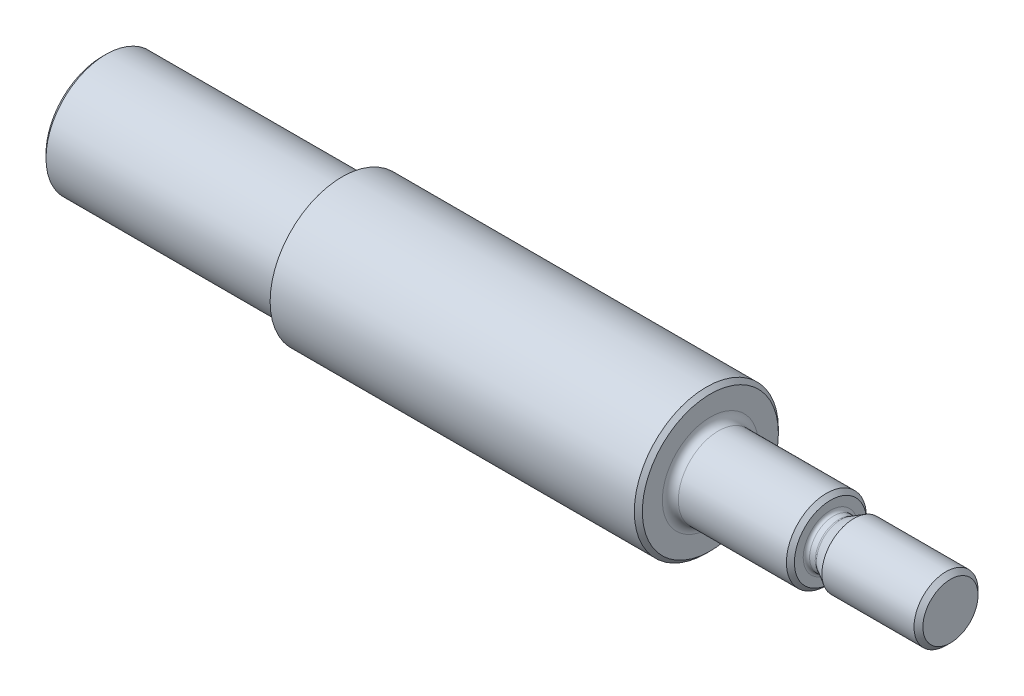
ISO-10303-21;
HEADER;
FILE_DESCRIPTION(('STEP AP214'),'2;1');
FILE_NAME('part.step','',(''),(''),'','','');
FILE_SCHEMA(('AUTOMOTIVE_DESIGN { 1 0 10303 214 1 1 1 1 }'));
ENDSEC;
DATA;
#1=APPLICATION_CONTEXT('core data for automotive mechanical design processes');
#2=APPLICATION_PROTOCOL_DEFINITION('international standard','automotive_design',2000,#1);
#3=PRODUCT_CONTEXT('',#1,'mechanical');
#4=PRODUCT('Part','Part','',(#3));
#5=PRODUCT_RELATED_PRODUCT_CATEGORY('part','',(#4));
#6=PRODUCT_DEFINITION_FORMATION('','',#4);
#7=PRODUCT_DEFINITION_CONTEXT('part definition',#1,'design');
#8=PRODUCT_DEFINITION('design','',#6,#7);
#9=PRODUCT_DEFINITION_SHAPE('','',#8);
#10=(LENGTH_UNIT() NAMED_UNIT(*) SI_UNIT(.MILLI.,.METRE.));
#11=(NAMED_UNIT(*) PLANE_ANGLE_UNIT() SI_UNIT($,.RADIAN.));
#12=(NAMED_UNIT(*) SI_UNIT($,.STERADIAN.) SOLID_ANGLE_UNIT());
#13=UNCERTAINTY_MEASURE_WITH_UNIT(LENGTH_MEASURE(1.E-05),#10,'distance_accuracy_value','');
#14=(GEOMETRIC_REPRESENTATION_CONTEXT(3) GLOBAL_UNCERTAINTY_ASSIGNED_CONTEXT((#13)) GLOBAL_UNIT_ASSIGNED_CONTEXT((#10,
#11,#12)) REPRESENTATION_CONTEXT('',''));
#15=CARTESIAN_POINT('',(0.,0.,0.));
#16=DIRECTION('',(0.,0.,1.));
#17=DIRECTION('',(1.,0.,0.));
#18=AXIS2_PLACEMENT_3D('',#15,#16,#17);
#19=CARTESIAN_POINT('',(0.,0.,0.));
#20=DIRECTION('',(-1.,0.,0.));
#21=DIRECTION('',(0.,0.,1.));
#22=AXIS2_PLACEMENT_3D('',#19,#20,#21);
#23=PLANE('',#22);
#24=CARTESIAN_POINT('',(0.,0.,0.));
#25=DIRECTION('',(-1.,0.,0.));
#26=DIRECTION('',(0.,0.,1.));
#27=AXIS2_PLACEMENT_3D('',#24,#25,#26);
#28=CIRCLE('',#27,6.99999999999998);
#29=CARTESIAN_POINT('',(0.,0.,-6.99999999999998));
#30=VERTEX_POINT('',#29);
#31=EDGE_CURVE('E92',#30,#30,#28,.T.);
#32=ORIENTED_EDGE('',*,*,#31,.T.);
#33=EDGE_LOOP('',(#32));
#34=FACE_BOUND('',#33,.T.);
#35=ADVANCED_FACE('F59',(#34),#23,.T.);
#36=CARTESIAN_POINT('',(0.,0.,0.));
#37=DIRECTION('',(-1.,0.,0.));
#38=DIRECTION('',(0.,0.,1.));
#39=AXIS2_PLACEMENT_3D('',#36,#37,#38);
#40=CYLINDRICAL_SURFACE('',#39,7.5);
#41=CARTESIAN_POINT('',(0.500000000000014,0.,0.));
#42=DIRECTION('',(-1.,0.,0.));
#43=DIRECTION('',(0.,0.,1.));
#44=AXIS2_PLACEMENT_3D('',#41,#42,#43);
#45=CIRCLE('',#44,7.5);
#46=CARTESIAN_POINT('',(0.500000000000014,0.,-7.49999999999999));
#47=VERTEX_POINT('',#46);
#48=EDGE_CURVE('E89',#47,#47,#45,.F.);
#49=ORIENTED_EDGE('',*,*,#48,.T.);
#50=EDGE_LOOP('',(#49));
#51=FACE_BOUND('',#50,.T.);
#52=CARTESIAN_POINT('',(29.,0.,0.));
#53=DIRECTION('',(-1.,0.,0.));
#54=DIRECTION('',(0.,0.,1.));
#55=AXIS2_PLACEMENT_3D('',#52,#53,#54);
#56=CIRCLE('',#55,7.5);
#57=CARTESIAN_POINT('',(29.,0.,7.5));
#58=VERTEX_POINT('',#57);
#59=EDGE_CURVE('E100',#58,#58,#56,.T.);
#60=ORIENTED_EDGE('',*,*,#59,.T.);
#61=EDGE_LOOP('',(#60));
#62=FACE_BOUND('',#61,.T.);
#63=ADVANCED_FACE('F164',(#51,#62),#40,.T.);
#64=CARTESIAN_POINT('',(30.,-7.49999999999999,0.));
#65=DIRECTION('',(-1.,0.,0.));
#66=DIRECTION('',(0.,0.,1.));
#67=AXIS2_PLACEMENT_3D('',#64,#65,#66);
#68=PLANE('',#67);
#69=CARTESIAN_POINT('',(30.,0.,0.));
#70=DIRECTION('',(-1.,0.,0.));
#71=DIRECTION('',(0.,0.,1.));
#72=AXIS2_PLACEMENT_3D('',#69,#70,#71);
#73=CIRCLE('',#72,8.5);
#74=CARTESIAN_POINT('',(30.,0.,8.5));
#75=VERTEX_POINT('',#74);
#76=EDGE_CURVE('E96',#75,#75,#73,.F.);
#77=ORIENTED_EDGE('',*,*,#76,.T.);
#78=EDGE_LOOP('',(#77));
#79=FACE_BOUND('',#78,.T.);
#80=CARTESIAN_POINT('',(30.,0.,0.));
#81=DIRECTION('',(-1.,0.,0.));
#82=DIRECTION('',(0.,0.,1.));
#83=AXIS2_PLACEMENT_3D('',#80,#81,#82);
#84=CIRCLE('',#83,9.);
#85=CARTESIAN_POINT('',(30.,0.,9.));
#86=VERTEX_POINT('',#85);
#87=EDGE_CURVE('E112',#86,#86,#84,.T.);
#88=ORIENTED_EDGE('',*,*,#87,.T.);
#89=EDGE_LOOP('',(#88));
#90=FACE_BOUND('',#89,.T.);
#91=ADVANCED_FACE('F170',(#79,#90),#68,.T.);
#92=CARTESIAN_POINT('',(0.,0.,0.));
#93=DIRECTION('',(-1.,0.,0.));
#94=DIRECTION('',(0.,0.,1.));
#95=AXIS2_PLACEMENT_3D('',#92,#93,#94);
#96=CYLINDRICAL_SURFACE('',#95,9.);
#97=CARTESIAN_POINT('',(75.5,0.,0.));
#98=DIRECTION('',(1.,0.,0.));
#99=DIRECTION('',(0.,0.,-1.));
#100=AXIS2_PLACEMENT_3D('',#97,#98,#99);
#101=CIRCLE('',#100,9.);
#102=CARTESIAN_POINT('',(75.5,0.,-9.));
#103=VERTEX_POINT('',#102);
#104=EDGE_CURVE('E68',#103,#103,#101,.F.);
#105=ORIENTED_EDGE('',*,*,#104,.T.);
#106=EDGE_LOOP('',(#105));
#107=FACE_BOUND('',#106,.T.);
#108=ORIENTED_EDGE('',*,*,#87,.F.);
#109=EDGE_LOOP('',(#108));
#110=FACE_BOUND('',#109,.T.);
#111=ADVANCED_FACE('F214',(#107,#110),#96,.T.);
#112=CARTESIAN_POINT('',(76.,-8.99999999999999,0.));
#113=DIRECTION('',(1.,0.,0.));
#114=DIRECTION('',(0.,0.,-1.));
#115=AXIS2_PLACEMENT_3D('',#112,#113,#114);
#116=PLANE('',#115);
#117=CARTESIAN_POINT('',(76.,0.,0.));
#118=DIRECTION('',(1.,0.,0.));
#119=DIRECTION('',(0.,0.,-1.));
#120=AXIS2_PLACEMENT_3D('',#117,#118,#119);
#121=CIRCLE('',#120,8.5);
#122=CARTESIAN_POINT('',(76.,0.,-8.49999999999999));
#123=VERTEX_POINT('',#122);
#124=EDGE_CURVE('E12',#123,#123,#121,.T.);
#125=ORIENTED_EDGE('',*,*,#124,.T.);
#126=EDGE_LOOP('',(#125));
#127=FACE_BOUND('',#126,.T.);
#128=CARTESIAN_POINT('',(76.,0.,0.));
#129=DIRECTION('',(1.,0.,0.));
#130=DIRECTION('',(0.,0.,-1.));
#131=AXIS2_PLACEMENT_3D('',#128,#129,#130);
#132=CIRCLE('',#131,6.);
#133=CARTESIAN_POINT('',(76.,0.,-5.99999999999999));
#134=VERTEX_POINT('',#133);
#135=EDGE_CURVE('E108',#134,#134,#132,.F.);
#136=ORIENTED_EDGE('',*,*,#135,.T.);
#137=EDGE_LOOP('',(#136));
#138=FACE_BOUND('',#137,.T.);
#139=ADVANCED_FACE('F207',(#127,#138),#116,.T.);
#140=CARTESIAN_POINT('',(0.,0.,0.));
#141=DIRECTION('',(-1.,0.,0.));
#142=DIRECTION('',(0.,0.,1.));
#143=AXIS2_PLACEMENT_3D('',#140,#141,#142);
#144=CYLINDRICAL_SURFACE('',#143,5.);
#145=CARTESIAN_POINT('',(90.5,0.,0.));
#146=DIRECTION('',(1.,0.,0.));
#147=DIRECTION('',(0.,0.,-1.));
#148=AXIS2_PLACEMENT_3D('',#145,#146,#147);
#149=CIRCLE('',#148,5.);
#150=CARTESIAN_POINT('',(90.5,0.,-5.));
#151=VERTEX_POINT('',#150);
#152=EDGE_CURVE('E83',#151,#151,#149,.F.);
#153=ORIENTED_EDGE('',*,*,#152,.T.);
#154=EDGE_LOOP('',(#153));
#155=FACE_BOUND('',#154,.T.);
#156=CARTESIAN_POINT('',(77.,0.,0.));
#157=DIRECTION('',(1.,0.,0.));
#158=DIRECTION('',(0.,0.,-1.));
#159=AXIS2_PLACEMENT_3D('',#156,#157,#158);
#160=CIRCLE('',#159,5.);
#161=CARTESIAN_POINT('',(77.,0.,-5.));
#162=VERTEX_POINT('',#161);
#163=EDGE_CURVE('E104',#162,#162,#160,.T.);
#164=ORIENTED_EDGE('',*,*,#163,.T.);
#165=EDGE_LOOP('',(#164));
#166=FACE_BOUND('',#165,.T.);
#167=ADVANCED_FACE('F204',(#155,#166),#144,.T.);
#168=CARTESIAN_POINT('',(91.,-5.,0.));
#169=DIRECTION('',(1.,0.,0.));
#170=DIRECTION('',(0.,0.,-1.));
#171=AXIS2_PLACEMENT_3D('',#168,#169,#170);
#172=PLANE('',#171);
#173=CARTESIAN_POINT('',(91.,0.,0.));
#174=DIRECTION('',(1.,0.,0.));
#175=DIRECTION('',(0.,0.,-1.));
#176=AXIS2_PLACEMENT_3D('',#173,#174,#175);
#177=CIRCLE('',#176,4.50000000000001);
#178=CARTESIAN_POINT('',(91.,0.,-4.50000000000001));
#179=VERTEX_POINT('',#178);
#180=EDGE_CURVE('E75',#179,#179,#177,.T.);
#181=ORIENTED_EDGE('',*,*,#180,.T.);
#182=EDGE_LOOP('',(#181));
#183=FACE_BOUND('',#182,.T.);
#184=CARTESIAN_POINT('',(91.,0.,0.));
#185=DIRECTION('',(-1.,0.,0.));
#186=DIRECTION('',(0.,0.,1.));
#187=AXIS2_PLACEMENT_3D('',#184,#185,#186);
#188=CIRCLE('',#187,3.4);
#189=CARTESIAN_POINT('',(91.,0.,3.4));
#190=VERTEX_POINT('',#189);
#191=EDGE_CURVE('E132',#190,#190,#188,.T.);
#192=ORIENTED_EDGE('',*,*,#191,.T.);
#193=EDGE_LOOP('',(#192));
#194=FACE_BOUND('',#193,.T.);
#195=ADVANCED_FACE('F179',(#183,#194),#172,.T.);
#196=CARTESIAN_POINT('',(77.,0.,0.));
#197=DIRECTION('',(1.,0.,0.));
#198=DIRECTION('',(0.,0.,-1.));
#199=AXIS2_PLACEMENT_3D('',#196,#197,#198);
#200=TOROIDAL_SURFACE('',#199,6.,1.);
#201=ORIENTED_EDGE('',*,*,#163,.F.);
#202=EDGE_LOOP('',(#201));
#203=FACE_BOUND('',#202,.T.);
#204=ORIENTED_EDGE('',*,*,#135,.F.);
#205=EDGE_LOOP('',(#204));
#206=FACE_BOUND('',#205,.T.);
#207=ADVANCED_FACE('F175',(#203,#206),#200,.F.);
#208=CARTESIAN_POINT('',(29.,0.,0.));
#209=DIRECTION('',(-1.,0.,0.));
#210=DIRECTION('',(0.,0.,1.));
#211=AXIS2_PLACEMENT_3D('',#208,#209,#210);
#212=TOROIDAL_SURFACE('',#211,8.5,1.);
#213=ORIENTED_EDGE('',*,*,#76,.F.);
#214=EDGE_LOOP('',(#213));
#215=FACE_BOUND('',#214,.T.);
#216=ORIENTED_EDGE('',*,*,#59,.F.);
#217=EDGE_LOOP('',(#216));
#218=FACE_BOUND('',#217,.T.);
#219=ADVANCED_FACE('F178',(#215,#218),#212,.F.);
#220=CARTESIAN_POINT('',(0.,0.,0.));
#221=DIRECTION('',(1.,0.,0.));
#222=DIRECTION('',(0.,0.,-1.));
#223=AXIS2_PLACEMENT_3D('',#220,#221,#222);
#224=CONICAL_SURFACE('',#223,6.99999999999998,0.785398163397451);
#225=CARTESIAN_POINT('',(0.500000000000014,0.,-7.49999999999999));
#226=CARTESIAN_POINT('',(0.494791666666681,0.,-7.49479166666666));
#227=CARTESIAN_POINT('',(0.489583333333347,0.,-7.48958333333333));
#228=CARTESIAN_POINT('',(0.479166666666681,0.,-7.47916666666666));
#229=CARTESIAN_POINT('',(0.473958333333347,0.,-7.47395833333333));
#230=CARTESIAN_POINT('',(0.46354166666668,0.,-7.46354166666666));
#231=CARTESIAN_POINT('',(0.458333333333347,0.,-7.45833333333333));
#232=CARTESIAN_POINT('',(0.44791666666668,0.,-7.44791666666666));
#233=CARTESIAN_POINT('',(0.442708333333346,0.,-7.44270833333333));
#234=CARTESIAN_POINT('',(0.432291666666679,0.,-7.43229166666666));
#235=CARTESIAN_POINT('',(0.427083333333346,0.,-7.42708333333333));
#236=CARTESIAN_POINT('',(0.416666666666679,0.,-7.41666666666666));
#237=CARTESIAN_POINT('',(0.411458333333345,0.,-7.41145833333333));
#238=CARTESIAN_POINT('',(0.401041666666678,0.,-7.40104166666666));
#239=CARTESIAN_POINT('',(0.395833333333345,0.,-7.39583333333332));
#240=CARTESIAN_POINT('',(0.385416666666678,0.,-7.38541666666666));
#241=CARTESIAN_POINT('',(0.380208333333344,0.,-7.38020833333332));
#242=CARTESIAN_POINT('',(0.369791666666677,0.,-7.36979166666666));
#243=CARTESIAN_POINT('',(0.364583333333344,0.,-7.36458333333332));
#244=CARTESIAN_POINT('',(0.354166666666677,0.,-7.35416666666666));
#245=CARTESIAN_POINT('',(0.348958333333344,0.,-7.34895833333332));
#246=CARTESIAN_POINT('',(0.338541666666677,0.,-7.33854166666666));
#247=CARTESIAN_POINT('',(0.333333333333343,0.,-7.33333333333332));
#248=CARTESIAN_POINT('',(0.322916666666676,0.,-7.32291666666666));
#249=CARTESIAN_POINT('',(0.317708333333342,0.,-7.31770833333332));
#250=CARTESIAN_POINT('',(0.307291666666676,0.,-7.30729166666665));
#251=CARTESIAN_POINT('',(0.302083333333342,0.,-7.30208333333332));
#252=CARTESIAN_POINT('',(0.291666666666675,0.,-7.29166666666665));
#253=CARTESIAN_POINT('',(0.286458333333342,0.,-7.28645833333332));
#254=CARTESIAN_POINT('',(0.276041666666675,0.,-7.27604166666665));
#255=CARTESIAN_POINT('',(0.270833333333341,0.,-7.27083333333332));
#256=CARTESIAN_POINT('',(0.260416666666674,0.,-7.26041666666665));
#257=CARTESIAN_POINT('',(0.255208333333341,0.,-7.25520833333332));
#258=CARTESIAN_POINT('',(0.244791666666674,0.,-7.24479166666665));
#259=CARTESIAN_POINT('',(0.23958333333334,0.,-7.23958333333332));
#260=CARTESIAN_POINT('',(0.229166666666673,0.,-7.22916666666665));
#261=CARTESIAN_POINT('',(0.22395833333334,0.,-7.22395833333332));
#262=CARTESIAN_POINT('',(0.213541666666673,0.,-7.21354166666665));
#263=CARTESIAN_POINT('',(0.208333333333339,0.,-7.20833333333332));
#264=CARTESIAN_POINT('',(0.197916666666672,0.,-7.19791666666665));
#265=CARTESIAN_POINT('',(0.192708333333339,0.,-7.19270833333332));
#266=CARTESIAN_POINT('',(0.182291666666672,0.,-7.18229166666665));
#267=CARTESIAN_POINT('',(0.177083333333338,0.,-7.17708333333332));
#268=CARTESIAN_POINT('',(0.166666666666671,0.,-7.16666666666665));
#269=CARTESIAN_POINT('',(0.161458333333338,0.,-7.16145833333332));
#270=CARTESIAN_POINT('',(0.151041666666671,0.,-7.15104166666665));
#271=CARTESIAN_POINT('',(0.145833333333338,0.,-7.14583333333332));
#272=CARTESIAN_POINT('',(0.135416666666671,0.,-7.13541666666665));
#273=CARTESIAN_POINT('',(0.130208333333337,0.,-7.13020833333332));
#274=CARTESIAN_POINT('',(0.11979166666667,0.,-7.11979166666665));
#275=CARTESIAN_POINT('',(0.114583333333337,0.,-7.11458333333331));
#276=CARTESIAN_POINT('',(0.10416666666667,0.,-7.10416666666665));
#277=CARTESIAN_POINT('',(0.0989583333333362,0.,-7.09895833333331));
#278=CARTESIAN_POINT('',(0.0885416666666691,0.,-7.08854166666665));
#279=CARTESIAN_POINT('',(0.0833333333333357,0.,-7.08333333333331));
#280=CARTESIAN_POINT('',(0.0729166666666688,0.,-7.07291666666665));
#281=CARTESIAN_POINT('',(0.0677083333333354,0.,-7.06770833333331));
#282=CARTESIAN_POINT('',(0.0572916666666683,0.,-7.05729166666665));
#283=CARTESIAN_POINT('',(0.0520833333333347,0.,-7.05208333333331));
#284=CARTESIAN_POINT('',(0.0416666666666678,0.,-7.04166666666665));
#285=CARTESIAN_POINT('',(0.0364583333333344,0.,-7.03645833333331));
#286=CARTESIAN_POINT('',(0.0260416666666675,0.,-7.02604166666664));
#287=CARTESIAN_POINT('',(0.0208333333333339,0.,-7.02083333333331));
#288=CARTESIAN_POINT('',(0.0104166666666668,0.,-7.01041666666664));
#289=CARTESIAN_POINT('',(0.00520833333333324,0.,-7.00520833333331));
#290=CARTESIAN_POINT('',(0.,0.,-6.99999999999998));
#291=B_SPLINE_CURVE_WITH_KNOTS('',3,(#225,#226,#227,#228,#229,#230,#231,#232,#233,#234,#235,
#236,#237,#238,#239,#240,#241,#242,#243,#244,#245,#246,#247,#248,#249,#250,#251,#252,#253,#254,
#255,#256,#257,#258,#259,#260,#261,#262,#263,#264,#265,#266,#267,#268,#269,#270,#271,#272,#273,
#274,#275,#276,#277,#278,#279,#280,#281,#282,#283,#284,#285,#286,#287,#288,#289,#290),
.UNSPECIFIED.,.F.,.F.,(4,2,2,2,2,2,2,2,2,2,2,2,2,2,2,2,2,2,2,2,2,2,2,2,2,2,2,2,2,2,2,2,4),(0.,
0.0220970869120799,0.0441941738241604,0.066291260736241,0.0883883476483209,0.110485434560401,
0.132582521472481,0.154679608384562,0.176776695296643,0.198873782208723,0.220970869120803,
0.243067956032883,0.265165042944964,0.287262129857044,0.309359216769124,0.331456303681205,
0.353553390593285,0.375650477505365,0.397747564417446,0.419844651329526,0.441941738241606,
0.464038825153686,0.486135912065767,0.508232998977847,0.530330085889927,0.552427172802008,
0.574524259714088,0.596621346626168,0.618718433538249,0.640815520450329,0.662912607362409,
0.685009694274489,0.70710678118657),.UNSPECIFIED.);
#292=EDGE_CURVE('BSEAM183',#47,#30,#291,.T.);
#293=ORIENTED_EDGE('',*,*,#48,.F.);
#294=ORIENTED_EDGE('',*,*,#31,.F.);
#295=ORIENTED_EDGE('',*,*,#292,.T.);
#296=ORIENTED_EDGE('',*,*,#292,.F.);
#297=EDGE_LOOP('',(#293,#295,#294,#296));
#298=FACE_BOUND('',#297,.T.);
#299=ADVANCED_FACE('F183',(#298),#224,.T.);
#300=CARTESIAN_POINT('',(90.5,0.,0.));
#301=DIRECTION('',(-1.,0.,0.));
#302=DIRECTION('',(0.,0.,1.));
#303=AXIS2_PLACEMENT_3D('',#300,#301,#302);
#304=CONICAL_SURFACE('',#303,5.,0.785398163397437);
#305=ORIENTED_EDGE('',*,*,#180,.F.);
#306=EDGE_LOOP('',(#305));
#307=FACE_BOUND('',#306,.T.);
#308=ORIENTED_EDGE('',*,*,#152,.F.);
#309=EDGE_LOOP('',(#308));
#310=FACE_BOUND('',#309,.T.);
#311=ADVANCED_FACE('F190',(#307,#310),#304,.T.);
#312=CARTESIAN_POINT('',(75.5,0.,0.));
#313=DIRECTION('',(-1.,0.,0.));
#314=DIRECTION('',(0.,0.,1.));
#315=AXIS2_PLACEMENT_3D('',#312,#313,#314);
#316=CONICAL_SURFACE('',#315,9.,0.785398163397448);
#317=ORIENTED_EDGE('',*,*,#124,.F.);
#318=EDGE_LOOP('',(#317));
#319=FACE_BOUND('',#318,.T.);
#320=ORIENTED_EDGE('',*,*,#104,.F.);
#321=EDGE_LOOP('',(#320));
#322=FACE_BOUND('',#321,.T.);
#323=ADVANCED_FACE('F62',(#319,#322),#316,.T.);
#324=CARTESIAN_POINT('',(106.,0.,0.));
#325=DIRECTION('',(-1.,0.,0.));
#326=DIRECTION('',(0.,0.,1.));
#327=AXIS2_PLACEMENT_3D('',#324,#325,#326);
#328=CYLINDRICAL_SURFACE('',#327,4.);
#329=CARTESIAN_POINT('',(93.9392304845413,0.,0.));
#330=DIRECTION('',(-1.,0.,0.));
#331=DIRECTION('',(0.,0.,1.));
#332=AXIS2_PLACEMENT_3D('',#329,#330,#331);
#333=CIRCLE('',#332,4.);
#334=CARTESIAN_POINT('',(93.9392304845413,0.,4.00000000000002));
#335=VERTEX_POINT('',#334);
#336=EDGE_CURVE('E116',#335,#335,#333,.T.);
#337=ORIENTED_EDGE('',*,*,#336,.F.);
#338=EDGE_LOOP('',(#337));
#339=FACE_BOUND('',#338,.T.);
#340=CARTESIAN_POINT('',(105.4455,0.,0.));
#341=DIRECTION('',(-1.,0.,0.));
#342=DIRECTION('',(0.,0.,1.));
#343=AXIS2_PLACEMENT_3D('',#340,#341,#342);
#344=CIRCLE('',#343,4.);
#345=CARTESIAN_POINT('',(105.4455,0.,4.));
#346=VERTEX_POINT('',#345);
#347=EDGE_CURVE('E140',#346,#346,#344,.T.);
#348=ORIENTED_EDGE('',*,*,#347,.T.);
#349=EDGE_LOOP('',(#348));
#350=FACE_BOUND('',#349,.T.);
#351=ADVANCED_FACE('F147',(#339,#350),#328,.T.);
#352=CARTESIAN_POINT('',(93.9392304845413,0.,0.));
#353=DIRECTION('',(1.,0.,0.));
#354=DIRECTION('',(0.,0.,-1.));
#355=AXIS2_PLACEMENT_3D('',#352,#353,#354);
#356=CONICAL_SURFACE('',#355,4.,0.523598775598299);
#357=CARTESIAN_POINT('',(92.3,0.,0.));
#358=DIRECTION('',(-1.,0.,0.));
#359=DIRECTION('',(0.,0.,1.));
#360=AXIS2_PLACEMENT_3D('',#357,#358,#359);
#361=CIRCLE('',#360,3.05358983848622);
#362=CARTESIAN_POINT('',(92.3,0.,3.05358983848624));
#363=VERTEX_POINT('',#362);
#364=EDGE_CURVE('E120',#363,#363,#361,.T.);
#365=ORIENTED_EDGE('',*,*,#364,.F.);
#366=EDGE_LOOP('',(#365));
#367=FACE_BOUND('',#366,.T.);
#368=ORIENTED_EDGE('',*,*,#336,.T.);
#369=EDGE_LOOP('',(#368));
#370=FACE_BOUND('',#369,.T.);
#371=ADVANCED_FACE('F277',(#367,#370),#356,.T.);
#372=CARTESIAN_POINT('',(92.1,0.,0.));
#373=DIRECTION('',(-1.,0.,0.));
#374=DIRECTION('',(0.,0.,1.));
#375=AXIS2_PLACEMENT_3D('',#372,#373,#374);
#376=TOROIDAL_SURFACE('',#375,3.4,0.4);
#377=CARTESIAN_POINT('',(92.1,0.,0.));
#378=DIRECTION('',(-1.,0.,0.));
#379=DIRECTION('',(0.,0.,1.));
#380=AXIS2_PLACEMENT_3D('',#377,#378,#379);
#381=CIRCLE('',#380,3.);
#382=CARTESIAN_POINT('',(92.1,0.,3.00000000000001));
#383=VERTEX_POINT('',#382);
#384=EDGE_CURVE('E124',#383,#383,#381,.T.);
#385=ORIENTED_EDGE('',*,*,#384,.F.);
#386=EDGE_LOOP('',(#385));
#387=FACE_BOUND('',#386,.T.);
#388=ORIENTED_EDGE('',*,*,#364,.T.);
#389=EDGE_LOOP('',(#388));
#390=FACE_BOUND('',#389,.T.);
#391=ADVANCED_FACE('F286',(#387,#390),#376,.F.);
#392=CARTESIAN_POINT('',(106.,0.,0.));
#393=DIRECTION('',(-1.,0.,0.));
#394=DIRECTION('',(0.,0.,1.));
#395=AXIS2_PLACEMENT_3D('',#392,#393,#394);
#396=CYLINDRICAL_SURFACE('',#395,3.);
#397=CARTESIAN_POINT('',(91.4,0.,0.));
#398=DIRECTION('',(-1.,0.,0.));
#399=DIRECTION('',(0.,0.,1.));
#400=AXIS2_PLACEMENT_3D('',#397,#398,#399);
#401=CIRCLE('',#400,3.);
#402=CARTESIAN_POINT('',(91.4,0.,3.));
#403=VERTEX_POINT('',#402);
#404=EDGE_CURVE('E128',#403,#403,#401,.T.);
#405=ORIENTED_EDGE('',*,*,#404,.F.);
#406=EDGE_LOOP('',(#405));
#407=FACE_BOUND('',#406,.T.);
#408=ORIENTED_EDGE('',*,*,#384,.T.);
#409=EDGE_LOOP('',(#408));
#410=FACE_BOUND('',#409,.T.);
#411=ADVANCED_FACE('F296',(#407,#410),#396,.T.);
#412=CARTESIAN_POINT('',(91.4,0.,0.));
#413=DIRECTION('',(-1.,0.,0.));
#414=DIRECTION('',(0.,0.,1.));
#415=AXIS2_PLACEMENT_3D('',#412,#413,#414);
#416=TOROIDAL_SURFACE('',#415,3.4,0.4);
#417=ORIENTED_EDGE('',*,*,#191,.F.);
#418=EDGE_LOOP('',(#417));
#419=FACE_BOUND('',#418,.T.);
#420=ORIENTED_EDGE('',*,*,#404,.T.);
#421=EDGE_LOOP('',(#420));
#422=FACE_BOUND('',#421,.T.);
#423=ADVANCED_FACE('F153',(#419,#422),#416,.F.);
#424=CARTESIAN_POINT('',(106.,0.,0.));
#425=DIRECTION('',(-1.,0.,0.));
#426=DIRECTION('',(0.,0.,1.));
#427=AXIS2_PLACEMENT_3D('',#424,#425,#426);
#428=CONICAL_SURFACE('',#427,3.4455,0.785398163397449);
#429=ORIENTED_EDGE('',*,*,#347,.F.);
#430=EDGE_LOOP('',(#429));
#431=FACE_BOUND('',#430,.T.);
#432=CARTESIAN_POINT('',(106.,0.,0.));
#433=DIRECTION('',(-1.,0.,0.));
#434=DIRECTION('',(0.,0.,1.));
#435=AXIS2_PLACEMENT_3D('',#432,#433,#434);
#436=CIRCLE('',#435,3.4455);
#437=CARTESIAN_POINT('',(106.,0.,3.44550000000001));
#438=VERTEX_POINT('',#437);
#439=EDGE_CURVE('E136',#438,#438,#436,.T.);
#440=ORIENTED_EDGE('',*,*,#439,.T.);
#441=EDGE_LOOP('',(#440));
#442=FACE_BOUND('',#441,.T.);
#443=ADVANCED_FACE('F149',(#431,#442),#428,.T.);
#444=CARTESIAN_POINT('',(106.,0.,0.));
#445=DIRECTION('',(1.,0.,0.));
#446=DIRECTION('',(0.,0.,-1.));
#447=AXIS2_PLACEMENT_3D('',#444,#445,#446);
#448=PLANE('',#447);
#449=ORIENTED_EDGE('',*,*,#439,.F.);
#450=EDGE_LOOP('',(#449));
#451=FACE_BOUND('',#450,.T.);
#452=ADVANCED_FACE('F152',(#451),#448,.T.);
#453=CLOSED_SHELL('',(#35,#63,#91,#111,#139,#167,#195,#207,#219,#299,#311,#323,#351,#371,#391,
#411,#423,#443,#452));
#454=MANIFOLD_SOLID_BREP('B2',#453);
#455=ADVANCED_BREP_SHAPE_REPRESENTATION('',(#18,#454),#14);
#456=SHAPE_DEFINITION_REPRESENTATION(#9,#455);
ENDSEC;
END-ISO-10303-21;
